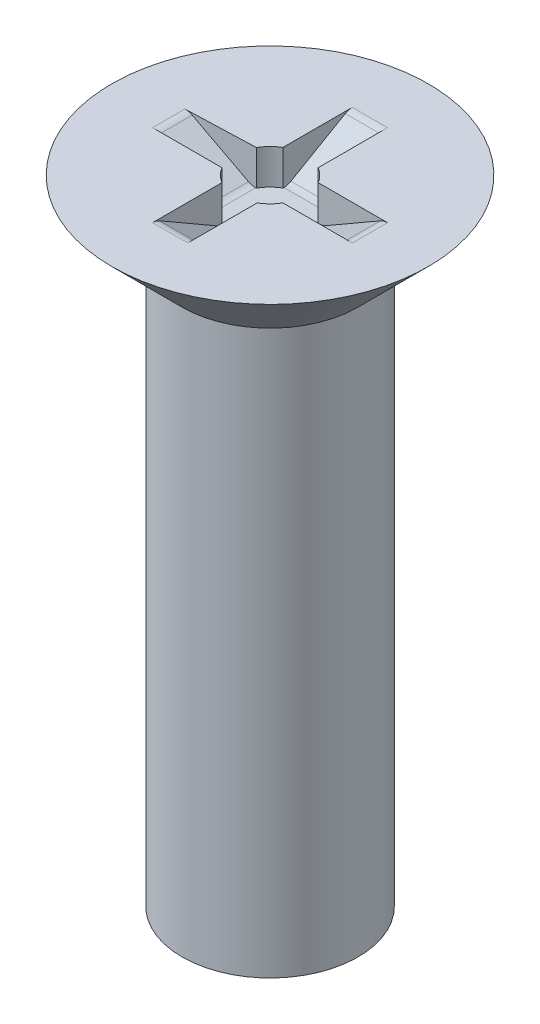
ISO-10303-21;
HEADER;
FILE_DESCRIPTION(('STEP AP214'),'2;1');
FILE_NAME('part.step','',(''),(''),'','','');
FILE_SCHEMA(('AUTOMOTIVE_DESIGN { 1 0 10303 214 1 1 1 1 }'));
ENDSEC;
DATA;
#1=APPLICATION_CONTEXT('core data for automotive mechanical design processes');
#2=APPLICATION_PROTOCOL_DEFINITION('international standard','automotive_design',2000,#1);
#3=PRODUCT_CONTEXT('',#1,'mechanical');
#4=PRODUCT('Part','Part','',(#3));
#5=PRODUCT_RELATED_PRODUCT_CATEGORY('part','',(#4));
#6=PRODUCT_DEFINITION_FORMATION('','',#4);
#7=PRODUCT_DEFINITION_CONTEXT('part definition',#1,'design');
#8=PRODUCT_DEFINITION('design','',#6,#7);
#9=PRODUCT_DEFINITION_SHAPE('','',#8);
#10=(LENGTH_UNIT() NAMED_UNIT(*) SI_UNIT(.MILLI.,.METRE.));
#11=(NAMED_UNIT(*) PLANE_ANGLE_UNIT() SI_UNIT($,.RADIAN.));
#12=(NAMED_UNIT(*) SI_UNIT($,.STERADIAN.) SOLID_ANGLE_UNIT());
#13=UNCERTAINTY_MEASURE_WITH_UNIT(LENGTH_MEASURE(1.E-05),#10,'distance_accuracy_value','');
#14=(GEOMETRIC_REPRESENTATION_CONTEXT(3) GLOBAL_UNCERTAINTY_ASSIGNED_CONTEXT((#13)) GLOBAL_UNIT_ASSIGNED_CONTEXT((#10,
#11,#12)) REPRESENTATION_CONTEXT('',''));
#15=CARTESIAN_POINT('',(0.,0.,0.));
#16=DIRECTION('',(0.,0.,1.));
#17=DIRECTION('',(1.,0.,0.));
#18=AXIS2_PLACEMENT_3D('',#15,#16,#17);
#19=CARTESIAN_POINT('',(0.,8.5,0.));
#20=DIRECTION('',(0.,1.,0.));
#21=DIRECTION('',(0.,0.,1.));
#22=AXIS2_PLACEMENT_3D('',#19,#20,#21);
#23=CYLINDRICAL_SURFACE('',#22,0.5);
#24=DIRECTION('',(0.,1.,0.));
#25=VECTOR('',#24,1.);
#26=CARTESIAN_POINT('',(-0.436712210598167,8.5,-0.243479865932406));
#27=LINE('',#26,#25);
#28=CARTESIAN_POINT('',(-0.436712210598167,8.5,-0.243479865932406));
#29=VERTEX_POINT('',#28);
#30=CARTESIAN_POINT('',(-0.436712210598167,9.,-0.243479865932406));
#31=VERTEX_POINT('',#30);
#32=EDGE_CURVE('E225',#29,#31,#27,.T.);
#33=ORIENTED_EDGE('',*,*,#32,.F.);
#34=CARTESIAN_POINT('',(0.,8.5,0.));
#35=DIRECTION('',(0.,1.,0.));
#36=DIRECTION('',(0.,0.,1.));
#37=AXIS2_PLACEMENT_3D('',#34,#35,#36);
#38=CIRCLE('',#37,0.5);
#39=CARTESIAN_POINT('',(-0.250000000000001,8.5,-0.433012701892218));
#40=VERTEX_POINT('',#39);
#41=EDGE_CURVE('E246',#40,#29,#38,.T.);
#42=ORIENTED_EDGE('',*,*,#41,.F.);
#43=DIRECTION('',(0.,1.,0.));
#44=VECTOR('',#43,1.);
#45=CARTESIAN_POINT('',(-0.250000000000001,8.5,-0.433012701892218));
#46=LINE('',#45,#44);
#47=CARTESIAN_POINT('',(-0.250000000000001,9.,-0.433012701892218));
#48=VERTEX_POINT('',#47);
#49=EDGE_CURVE('E384',#40,#48,#46,.T.);
#50=ORIENTED_EDGE('',*,*,#49,.T.);
#51=CARTESIAN_POINT('',(0.,9.,0.));
#52=DIRECTION('',(0.,1.,0.));
#53=DIRECTION('',(0.,0.,1.));
#54=AXIS2_PLACEMENT_3D('',#51,#52,#53);
#55=CIRCLE('',#54,0.5);
#56=EDGE_CURVE('E231',#48,#31,#55,.T.);
#57=ORIENTED_EDGE('',*,*,#56,.T.);
#58=EDGE_LOOP('',(#33,#42,#50,#57));
#59=FACE_BOUND('',#58,.T.);
#60=ADVANCED_FACE('F45',(#59),#23,.F.);
#61=DIRECTION('',(0.,1.,0.));
#62=VECTOR('',#61,1.);
#63=CARTESIAN_POINT('',(0.249999999999999,8.5,-0.43301270189222));
#64=LINE('',#63,#62);
#65=CARTESIAN_POINT('',(0.249999999999999,8.5,-0.43301270189222));
#66=VERTEX_POINT('',#65);
#67=CARTESIAN_POINT('',(0.249999999999999,9.,-0.43301270189222));
#68=VERTEX_POINT('',#67);
#69=EDGE_CURVE('E382',#66,#68,#64,.T.);
#70=ORIENTED_EDGE('',*,*,#69,.F.);
#71=CARTESIAN_POINT('',(0.433012701892219,8.5,-0.25));
#72=VERTEX_POINT('',#71);
#73=EDGE_CURVE('E252',#72,#66,#38,.T.);
#74=ORIENTED_EDGE('',*,*,#73,.F.);
#75=DIRECTION('',(0.,1.,0.));
#76=VECTOR('',#75,1.);
#77=CARTESIAN_POINT('',(0.433012701892219,8.5,-0.25));
#78=LINE('',#77,#76);
#79=CARTESIAN_POINT('',(0.433012701892219,9.,-0.25));
#80=VERTEX_POINT('',#79);
#81=EDGE_CURVE('E236',#72,#80,#78,.T.);
#82=ORIENTED_EDGE('',*,*,#81,.T.);
#83=EDGE_CURVE('E234',#80,#68,#55,.T.);
#84=ORIENTED_EDGE('',*,*,#83,.T.);
#85=EDGE_LOOP('',(#70,#74,#82,#84));
#86=FACE_BOUND('',#85,.T.);
#87=ADVANCED_FACE('F404',(#86),#23,.F.);
#88=CARTESIAN_POINT('',(-0.433012701892219,8.5,0.25));
#89=VERTEX_POINT('',#88);
#90=CARTESIAN_POINT('',(-0.249999999999995,8.5,0.433012701892222));
#91=VERTEX_POINT('',#90);
#92=EDGE_CURVE('E223',#89,#91,#38,.T.);
#93=ORIENTED_EDGE('',*,*,#92,.F.);
#94=DIRECTION('',(0.,1.,0.));
#95=VECTOR('',#94,1.);
#96=CARTESIAN_POINT('',(-0.433012701892219,8.5,0.25));
#97=LINE('',#96,#95);
#98=CARTESIAN_POINT('',(-0.433012701892219,9.,0.25));
#99=VERTEX_POINT('',#98);
#100=EDGE_CURVE('E206',#89,#99,#97,.T.);
#101=ORIENTED_EDGE('',*,*,#100,.T.);
#102=CARTESIAN_POINT('',(-0.249999999999995,9.,0.433012701892222));
#103=VERTEX_POINT('',#102);
#104=EDGE_CURVE('E221',#99,#103,#55,.T.);
#105=ORIENTED_EDGE('',*,*,#104,.T.);
#106=DIRECTION('',(0.,1.,0.));
#107=VECTOR('',#106,1.);
#108=CARTESIAN_POINT('',(-0.249999999999995,8.5,0.433012701892222));
#109=LINE('',#108,#107);
#110=EDGE_CURVE('E356',#91,#103,#109,.T.);
#111=ORIENTED_EDGE('',*,*,#110,.F.);
#112=EDGE_LOOP('',(#93,#101,#105,#111));
#113=FACE_BOUND('',#112,.T.);
#114=ADVANCED_FACE('F219',(#113),#23,.F.);
#115=CARTESIAN_POINT('',(0.,8.,0.));
#116=DIRECTION('',(0.,-1.,0.));
#117=DIRECTION('',(0.,0.,-1.));
#118=AXIS2_PLACEMENT_3D('',#115,#116,#117);
#119=CYLINDRICAL_SURFACE('',#118,1.25);
#120=CARTESIAN_POINT('',(0.,8.,0.));
#121=DIRECTION('',(0.,1.,0.));
#122=DIRECTION('',(0.,0.,1.));
#123=AXIS2_PLACEMENT_3D('',#120,#121,#122);
#124=CIRCLE('',#123,1.25);
#125=CARTESIAN_POINT('',(0.,8.,1.25));
#126=VERTEX_POINT('',#125);
#127=EDGE_CURVE('E265',#126,#126,#124,.T.);
#128=ORIENTED_EDGE('',*,*,#127,.F.);
#129=EDGE_LOOP('',(#128));
#130=FACE_BOUND('',#129,.T.);
#131=CARTESIAN_POINT('',(0.,0.,0.));
#132=DIRECTION('',(0.,1.,0.));
#133=DIRECTION('',(0.,0.,1.));
#134=AXIS2_PLACEMENT_3D('',#131,#132,#133);
#135=CIRCLE('',#134,1.25);
#136=CARTESIAN_POINT('',(0.,0.,1.25));
#137=VERTEX_POINT('',#136);
#138=EDGE_CURVE('E262',#137,#137,#135,.T.);
#139=ORIENTED_EDGE('',*,*,#138,.T.);
#140=EDGE_LOOP('',(#139));
#141=FACE_BOUND('',#140,.T.);
#142=ADVANCED_FACE('F438',(#130,#141),#119,.T.);
#143=CARTESIAN_POINT('',(0.,0.,0.));
#144=DIRECTION('',(0.,1.,0.));
#145=DIRECTION('',(0.,0.,1.));
#146=AXIS2_PLACEMENT_3D('',#143,#144,#145);
#147=PLANE('',#146);
#148=ORIENTED_EDGE('',*,*,#138,.F.);
#149=EDGE_LOOP('',(#148));
#150=FACE_BOUND('',#149,.T.);
#151=ADVANCED_FACE('F435',(#150),#147,.F.);
#152=CARTESIAN_POINT('',(0.,9.,0.));
#153=DIRECTION('',(0.,1.,0.));
#154=DIRECTION('',(0.,0.,1.));
#155=AXIS2_PLACEMENT_3D('',#152,#153,#154);
#156=PLANE('',#155);
#157=DIRECTION('',(-1.,0.,0.));
#158=VECTOR('',#157,1.);
#159=CARTESIAN_POINT('',(-0.249999999999985,9.,1.41961524227065));
#160=LINE('',#159,#158);
#161=CARTESIAN_POINT('',(0.250000000000015,9.,1.41961524227065));
#162=VERTEX_POINT('',#161);
#163=CARTESIAN_POINT('',(-0.249999999999985,9.,1.41961524227065));
#164=VERTEX_POINT('',#163);
#165=EDGE_CURVE('E287',#162,#164,#160,.T.);
#166=ORIENTED_EDGE('',*,*,#165,.T.);
#167=DIRECTION('',(0.,0.,-1.));
#168=VECTOR('',#167,1.);
#169=CARTESIAN_POINT('',(-0.249999999999986,9.,1.36602540378443));
#170=LINE('',#169,#168);
#171=EDGE_CURVE('E224',#164,#103,#170,.T.);
#172=ORIENTED_EDGE('',*,*,#171,.T.);
#173=ORIENTED_EDGE('',*,*,#104,.F.);
#174=DIRECTION('',(-1.,0.,0.));
#175=VECTOR('',#174,1.);
#176=CARTESIAN_POINT('',(-0.25,9.,0.25));
#177=LINE('',#176,#175);
#178=CARTESIAN_POINT('',(-1.41961524227065,9.,0.25));
#179=VERTEX_POINT('',#178);
#180=EDGE_CURVE('E202',#99,#179,#177,.T.);
#181=ORIENTED_EDGE('',*,*,#180,.T.);
#182=DIRECTION('',(0.,0.,-1.));
#183=VECTOR('',#182,1.);
#184=CARTESIAN_POINT('',(-1.41961524227065,9.,-0.211027534127505));
#185=LINE('',#184,#183);
#186=CARTESIAN_POINT('',(-1.41961524227065,9.,-0.209156135730628));
#187=VERTEX_POINT('',#186);
#188=EDGE_CURVE('E282',#179,#187,#185,.T.);
#189=ORIENTED_EDGE('',*,*,#188,.T.);
#190=DIRECTION('',(0.999390827019096,0.,-0.0348994967025045));
#191=VECTOR('',#190,1.);
#192=CARTESIAN_POINT('',(-0.00902405293553858,9.,-0.258415065500495));
#193=LINE('',#192,#191);
#194=EDGE_CURVE('E277',#187,#31,#193,.T.);
#195=ORIENTED_EDGE('',*,*,#194,.T.);
#196=ORIENTED_EDGE('',*,*,#56,.F.);
#197=DIRECTION('',(0.,0.,-1.));
#198=VECTOR('',#197,1.);
#199=CARTESIAN_POINT('',(-0.250000000000001,9.,-0.249999999999999));
#200=LINE('',#199,#198);
#201=CARTESIAN_POINT('',(-0.250000000000005,9.,-1.41961524227065));
#202=VERTEX_POINT('',#201);
#203=EDGE_CURVE('E351',#48,#202,#200,.T.);
#204=ORIENTED_EDGE('',*,*,#203,.T.);
#205=DIRECTION('',(1.,0.,0.));
#206=VECTOR('',#205,1.);
#207=CARTESIAN_POINT('',(0.249999999999995,9.,-1.41961524227065));
#208=LINE('',#207,#206);
#209=CARTESIAN_POINT('',(0.249999999999995,9.,-1.41961524227065));
#210=VERTEX_POINT('',#209);
#211=EDGE_CURVE('E269',#202,#210,#208,.T.);
#212=ORIENTED_EDGE('',*,*,#211,.T.);
#213=DIRECTION('',(0.,0.,1.));
#214=VECTOR('',#213,1.);
#215=CARTESIAN_POINT('',(0.249999999999995,9.,-1.36602540378443));
#216=LINE('',#215,#214);
#217=EDGE_CURVE('E340',#210,#68,#216,.T.);
#218=ORIENTED_EDGE('',*,*,#217,.T.);
#219=ORIENTED_EDGE('',*,*,#83,.F.);
#220=DIRECTION('',(1.,0.,0.));
#221=VECTOR('',#220,1.);
#222=CARTESIAN_POINT('',(0.25,9.,-0.25));
#223=LINE('',#222,#221);
#224=CARTESIAN_POINT('',(1.41961524227065,9.,-0.25));
#225=VERTEX_POINT('',#224);
#226=EDGE_CURVE('E387',#80,#225,#223,.T.);
#227=ORIENTED_EDGE('',*,*,#226,.T.);
#228=DIRECTION('',(0.,0.,1.));
#229=VECTOR('',#228,1.);
#230=CARTESIAN_POINT('',(1.41961524227065,9.,0.25));
#231=LINE('',#230,#229);
#232=CARTESIAN_POINT('',(1.41961524227065,9.,0.25));
#233=VERTEX_POINT('',#232);
#234=EDGE_CURVE('E284',#225,#233,#231,.T.);
#235=ORIENTED_EDGE('',*,*,#234,.T.);
#236=DIRECTION('',(-1.,0.,0.));
#237=VECTOR('',#236,1.);
#238=CARTESIAN_POINT('',(1.36602540378443,9.,0.25));
#239=LINE('',#238,#237);
#240=CARTESIAN_POINT('',(0.433012701892219,9.,0.25));
#241=VERTEX_POINT('',#240);
#242=EDGE_CURVE('E386',#233,#241,#239,.T.);
#243=ORIENTED_EDGE('',*,*,#242,.T.);
#244=CARTESIAN_POINT('',(0.250000000000004,9.,0.433012701892217));
#245=VERTEX_POINT('',#244);
#246=EDGE_CURVE('E232',#245,#241,#55,.T.);
#247=ORIENTED_EDGE('',*,*,#246,.F.);
#248=DIRECTION('',(0.,0.,1.));
#249=VECTOR('',#248,1.);
#250=CARTESIAN_POINT('',(0.250000000000003,9.,0.249999999999997));
#251=LINE('',#250,#249);
#252=EDGE_CURVE('E363',#245,#162,#251,.T.);
#253=ORIENTED_EDGE('',*,*,#252,.T.);
#254=EDGE_LOOP('',(#166,#172,#173,#181,#189,#195,#196,#204,#212,#218,#219,#227,#235,#243,#247,#253));
#255=FACE_BOUND('',#254,.T.);
#256=CARTESIAN_POINT('',(0.,9.,0.));
#257=DIRECTION('',(0.,1.,0.));
#258=DIRECTION('',(0.,0.,1.));
#259=AXIS2_PLACEMENT_3D('',#256,#257,#258);
#260=CIRCLE('',#259,2.25);
#261=CARTESIAN_POINT('',(0.,9.,2.25));
#262=VERTEX_POINT('',#261);
#263=EDGE_CURVE('E258',#262,#262,#260,.T.);
#264=ORIENTED_EDGE('',*,*,#263,.T.);
#265=EDGE_LOOP('',(#264));
#266=FACE_BOUND('',#265,.T.);
#267=ADVANCED_FACE('F229',(#255,#266),#156,.T.);
#268=CARTESIAN_POINT('',(0.,9.,0.));
#269=DIRECTION('',(0.,1.,0.));
#270=DIRECTION('',(0.,0.,1.));
#271=AXIS2_PLACEMENT_3D('',#268,#269,#270);
#272=CONICAL_SURFACE('',#271,2.25,0.78539816339745);
#273=ORIENTED_EDGE('',*,*,#127,.T.);
#274=EDGE_LOOP('',(#273));
#275=FACE_BOUND('',#274,.T.);
#276=ORIENTED_EDGE('',*,*,#263,.F.);
#277=EDGE_LOOP('',(#276));
#278=FACE_BOUND('',#277,.T.);
#279=ADVANCED_FACE('F424',(#275,#278),#272,.T.);
#280=CARTESIAN_POINT('',(0.250000000000005,8.5,0.433012701892217));
#281=VERTEX_POINT('',#280);
#282=CARTESIAN_POINT('',(0.433012701892219,8.5,0.25));
#283=VERTEX_POINT('',#282);
#284=EDGE_CURVE('E240',#281,#283,#38,.T.);
#285=ORIENTED_EDGE('',*,*,#284,.F.);
#286=DIRECTION('',(0.,1.,0.));
#287=VECTOR('',#286,1.);
#288=CARTESIAN_POINT('',(0.250000000000005,8.5,0.433012701892217));
#289=LINE('',#288,#287);
#290=EDGE_CURVE('E379',#281,#245,#289,.T.);
#291=ORIENTED_EDGE('',*,*,#290,.T.);
#292=ORIENTED_EDGE('',*,*,#246,.T.);
#293=DIRECTION('',(0.,1.,0.));
#294=VECTOR('',#293,1.);
#295=CARTESIAN_POINT('',(0.433012701892219,8.5,0.25));
#296=LINE('',#295,#294);
#297=EDGE_CURVE('E395',#283,#241,#296,.T.);
#298=ORIENTED_EDGE('',*,*,#297,.F.);
#299=EDGE_LOOP('',(#285,#291,#292,#298));
#300=FACE_BOUND('',#299,.T.);
#301=ADVANCED_FACE('F416',(#300),#23,.F.);
#302=CARTESIAN_POINT('',(0.,8.5,0.));
#303=DIRECTION('',(0.,1.,0.));
#304=DIRECTION('',(0.,0.,1.));
#305=AXIS2_PLACEMENT_3D('',#302,#303,#304);
#306=PLANE('',#305);
#307=DIRECTION('',(-1.,0.,0.));
#308=VECTOR('',#307,1.);
#309=CARTESIAN_POINT('',(0.5,8.5,0.25));
#310=LINE('',#309,#308);
#311=CARTESIAN_POINT('',(0.446410161513777,8.5,0.25));
#312=VERTEX_POINT('',#311);
#313=EDGE_CURVE('E390',#312,#283,#310,.T.);
#314=ORIENTED_EDGE('',*,*,#313,.F.);
#315=DIRECTION('',(0.,0.,1.));
#316=VECTOR('',#315,1.);
#317=CARTESIAN_POINT('',(0.446410161513777,8.5,0.));
#318=LINE('',#317,#316);
#319=CARTESIAN_POINT('',(0.446410161513777,8.5,-0.25));
#320=VERTEX_POINT('',#319);
#321=EDGE_CURVE('E302',#312,#320,#318,.F.);
#322=ORIENTED_EDGE('',*,*,#321,.T.);
#323=DIRECTION('',(-1.,0.,0.));
#324=VECTOR('',#323,1.);
#325=CARTESIAN_POINT('',(0.5,8.5,-0.25));
#326=LINE('',#325,#324);
#327=EDGE_CURVE('E393',#320,#72,#326,.T.);
#328=ORIENTED_EDGE('',*,*,#327,.T.);
#329=ORIENTED_EDGE('',*,*,#73,.T.);
#330=DIRECTION('',(0.,0.,1.));
#331=VECTOR('',#330,1.);
#332=CARTESIAN_POINT('',(0.249999999999998,8.5,-0.500000000000001));
#333=LINE('',#332,#331);
#334=CARTESIAN_POINT('',(0.249999999999998,8.5,-0.446410161513778));
#335=VERTEX_POINT('',#334);
#336=EDGE_CURVE('E345',#335,#66,#333,.T.);
#337=ORIENTED_EDGE('',*,*,#336,.F.);
#338=DIRECTION('',(1.,0.,0.));
#339=VECTOR('',#338,1.);
#340=CARTESIAN_POINT('',(0.,8.5,-0.446410161513777));
#341=LINE('',#340,#339);
#342=CARTESIAN_POINT('',(-0.250000000000002,8.5,-0.446410161513776));
#343=VERTEX_POINT('',#342);
#344=EDGE_CURVE('E298',#335,#343,#341,.F.);
#345=ORIENTED_EDGE('',*,*,#344,.T.);
#346=DIRECTION('',(0.,0.,1.));
#347=VECTOR('',#346,1.);
#348=CARTESIAN_POINT('',(-0.250000000000002,8.5,-0.499999999999999));
#349=LINE('',#348,#347);
#350=EDGE_CURVE('E354',#343,#40,#349,.T.);
#351=ORIENTED_EDGE('',*,*,#350,.T.);
#352=ORIENTED_EDGE('',*,*,#41,.T.);
#353=DIRECTION('',(0.999390827019096,0.,-0.0348994967025045));
#354=VECTOR('',#353,1.);
#355=CARTESIAN_POINT('',(-0.00902405293553858,8.5,-0.258415065500495));
#356=LINE('',#355,#354);
#357=CARTESIAN_POINT('',(-0.446410161513777,8.5,-0.24314120602394));
#358=VERTEX_POINT('',#357);
#359=EDGE_CURVE('E216',#358,#29,#356,.T.);
#360=ORIENTED_EDGE('',*,*,#359,.F.);
#361=DIRECTION('',(0.,0.,-1.));
#362=VECTOR('',#361,1.);
#363=CARTESIAN_POINT('',(-0.446410161513777,8.5,0.));
#364=LINE('',#363,#362);
#365=CARTESIAN_POINT('',(-0.446410161513777,8.5,0.25));
#366=VERTEX_POINT('',#365);
#367=EDGE_CURVE('E300',#358,#366,#364,.F.);
#368=ORIENTED_EDGE('',*,*,#367,.T.);
#369=DIRECTION('',(1.,0.,0.));
#370=VECTOR('',#369,1.);
#371=CARTESIAN_POINT('',(-0.5,8.5,0.25));
#372=LINE('',#371,#370);
#373=EDGE_CURVE('E272',#366,#89,#372,.T.);
#374=ORIENTED_EDGE('',*,*,#373,.T.);
#375=ORIENTED_EDGE('',*,*,#92,.T.);
#376=DIRECTION('',(0.,0.,-1.));
#377=VECTOR('',#376,1.);
#378=CARTESIAN_POINT('',(-0.249999999999995,8.5,0.500000000000003));
#379=LINE('',#378,#377);
#380=CARTESIAN_POINT('',(-0.249999999999995,8.5,0.500000000000003));
#381=VERTEX_POINT('',#380);
#382=EDGE_CURVE('E366',#381,#91,#379,.T.);
#383=ORIENTED_EDGE('',*,*,#382,.F.);
#384=DIRECTION('',(-1.,0.,0.));
#385=VECTOR('',#384,1.);
#386=CARTESIAN_POINT('',(0.250000000000005,8.5,0.499999999999997));
#387=LINE('',#386,#385);
#388=CARTESIAN_POINT('',(0.250000000000005,8.5,0.499999999999997));
#389=VERTEX_POINT('',#388);
#390=EDGE_CURVE('E360',#389,#381,#387,.T.);
#391=ORIENTED_EDGE('',*,*,#390,.F.);
#392=DIRECTION('',(0.,0.,-1.));
#393=VECTOR('',#392,1.);
#394=CARTESIAN_POINT('',(0.250000000000005,8.5,0.499999999999997));
#395=LINE('',#394,#393);
#396=EDGE_CURVE('E369',#389,#281,#395,.T.);
#397=ORIENTED_EDGE('',*,*,#396,.T.);
#398=ORIENTED_EDGE('',*,*,#284,.T.);
#399=EDGE_LOOP('',(#314,#322,#328,#329,#337,#345,#351,#352,#360,#368,#374,#375,#383,#391,#397,#398));
#400=FACE_BOUND('',#399,.T.);
#401=ADVANCED_FACE('F412',(#400),#306,.T.);
#402=CARTESIAN_POINT('',(0.,0.,-0.25));
#403=DIRECTION('',(0.,0.,-1.));
#404=DIRECTION('',(-1.,0.,0.));
#405=AXIS2_PLACEMENT_3D('',#402,#403,#404);
#406=PLANE('',#405);
#407=ORIENTED_EDGE('',*,*,#327,.F.);
#408=CARTESIAN_POINT('',(0.446410161513777,8.7,-0.25));
#409=DIRECTION('',(0.,0.,-1.));
#410=DIRECTION('',(-1.,0.,0.));
#411=AXIS2_PLACEMENT_3D('',#408,#409,#410);
#412=CIRCLE('',#411,0.2);
#413=CARTESIAN_POINT('',(0.546410161513778,8.52679491924311,-0.25));
#414=VERTEX_POINT('',#413);
#415=EDGE_CURVE('E304',#320,#414,#412,.F.);
#416=ORIENTED_EDGE('',*,*,#415,.T.);
#417=DIRECTION('',(0.866025403784436,0.500000000000004,0.));
#418=VECTOR('',#417,1.);
#419=CARTESIAN_POINT('',(0.5,8.5,-0.25));
#420=LINE('',#419,#418);
#421=CARTESIAN_POINT('',(1.31961524227065,8.97320508075689,-0.25));
#422=VERTEX_POINT('',#421);
#423=EDGE_CURVE('E389',#414,#422,#420,.T.);
#424=ORIENTED_EDGE('',*,*,#423,.T.);
#425=CARTESIAN_POINT('',(1.41961524227065,8.8,-0.25));
#426=DIRECTION('',(0.,0.,-1.));
#427=DIRECTION('',(-1.,0.,0.));
#428=AXIS2_PLACEMENT_3D('',#425,#426,#427);
#429=CIRCLE('',#428,0.2);
#430=EDGE_CURVE('E329',#422,#225,#429,.T.);
#431=ORIENTED_EDGE('',*,*,#430,.T.);
#432=ORIENTED_EDGE('',*,*,#226,.F.);
#433=ORIENTED_EDGE('',*,*,#81,.F.);
#434=EDGE_LOOP('',(#407,#416,#424,#431,#432,#433));
#435=FACE_BOUND('',#434,.T.);
#436=ADVANCED_FACE('F415',(#435),#406,.F.);
#437=CARTESIAN_POINT('',(0.,0.,0.25));
#438=DIRECTION('',(0.,0.,-1.));
#439=DIRECTION('',(-1.,0.,0.));
#440=AXIS2_PLACEMENT_3D('',#437,#438,#439);
#441=PLANE('',#440);
#442=DIRECTION('',(0.866025403784436,0.500000000000004,0.));
#443=VECTOR('',#442,1.);
#444=CARTESIAN_POINT('',(0.5,8.5,0.25));
#445=LINE('',#444,#443);
#446=CARTESIAN_POINT('',(0.546410161513778,8.52679491924311,0.25));
#447=VERTEX_POINT('',#446);
#448=CARTESIAN_POINT('',(1.31961524227065,8.97320508075689,0.25));
#449=VERTEX_POINT('',#448);
#450=EDGE_CURVE('E398',#447,#449,#445,.T.);
#451=ORIENTED_EDGE('',*,*,#450,.F.);
#452=CARTESIAN_POINT('',(0.446410161513777,8.7,0.25));
#453=DIRECTION('',(0.,0.,-1.));
#454=DIRECTION('',(-1.,0.,0.));
#455=AXIS2_PLACEMENT_3D('',#452,#453,#454);
#456=CIRCLE('',#455,0.2);
#457=EDGE_CURVE('E296',#447,#312,#456,.T.);
#458=ORIENTED_EDGE('',*,*,#457,.T.);
#459=ORIENTED_EDGE('',*,*,#313,.T.);
#460=ORIENTED_EDGE('',*,*,#297,.T.);
#461=ORIENTED_EDGE('',*,*,#242,.F.);
#462=CARTESIAN_POINT('',(1.41961524227065,8.8,0.25));
#463=DIRECTION('',(0.,0.,-1.));
#464=DIRECTION('',(-1.,0.,0.));
#465=AXIS2_PLACEMENT_3D('',#462,#463,#464);
#466=CIRCLE('',#465,0.2);
#467=EDGE_CURVE('E327',#233,#449,#466,.F.);
#468=ORIENTED_EDGE('',*,*,#467,.T.);
#469=EDGE_LOOP('',(#451,#458,#459,#460,#461,#468));
#470=FACE_BOUND('',#469,.T.);
#471=ADVANCED_FACE('F422',(#470),#441,.T.);
#472=CARTESIAN_POINT('',(0.5,8.5,-0.25));
#473=DIRECTION('',(0.500000000000004,-0.866025403784436,0.));
#474=DIRECTION('',(0.866025403784436,0.500000000000004,0.));
#475=AXIS2_PLACEMENT_3D('',#472,#473,#474);
#476=PLANE('',#475);
#477=ORIENTED_EDGE('',*,*,#450,.T.);
#478=DIRECTION('',(0.,0.,1.));
#479=VECTOR('',#478,1.);
#480=CARTESIAN_POINT('',(1.31961524227065,8.97320508075689,-0.25));
#481=LINE('',#480,#479);
#482=EDGE_CURVE('E294',#449,#422,#481,.F.);
#483=ORIENTED_EDGE('',*,*,#482,.T.);
#484=ORIENTED_EDGE('',*,*,#423,.F.);
#485=DIRECTION('',(0.,0.,1.));
#486=VECTOR('',#485,1.);
#487=CARTESIAN_POINT('',(0.546410161513778,8.52679491924311,-0.25));
#488=LINE('',#487,#486);
#489=EDGE_CURVE('E291',#414,#447,#488,.T.);
#490=ORIENTED_EDGE('',*,*,#489,.T.);
#491=EDGE_LOOP('',(#477,#483,#484,#490));
#492=FACE_BOUND('',#491,.T.);
#493=ADVANCED_FACE('F605',(#492),#476,.F.);
#494=CARTESIAN_POINT('',(0.25,0.,0.));
#495=DIRECTION('',(1.,0.,0.));
#496=DIRECTION('',(0.,0.,-1.));
#497=AXIS2_PLACEMENT_3D('',#494,#495,#496);
#498=PLANE('',#497);
#499=ORIENTED_EDGE('',*,*,#396,.F.);
#500=DIRECTION('',(0.,0.500000000000004,0.866025403784436));
#501=VECTOR('',#500,1.);
#502=CARTESIAN_POINT('',(0.250000000000005,8.5,0.499999999999997));
#503=LINE('',#502,#501);
#504=CARTESIAN_POINT('',(0.250000000000014,8.97320508075689,1.31961524227065));
#505=VERTEX_POINT('',#504);
#506=EDGE_CURVE('E365',#389,#505,#503,.T.);
#507=ORIENTED_EDGE('',*,*,#506,.T.);
#508=CARTESIAN_POINT('',(0.250000000000015,8.8,1.41961524227065));
#509=DIRECTION('',(1.,0.,0.));
#510=DIRECTION('',(0.,0.,-1.));
#511=AXIS2_PLACEMENT_3D('',#508,#509,#510);
#512=CIRCLE('',#511,0.2);
#513=EDGE_CURVE('E324',#505,#162,#512,.T.);
#514=ORIENTED_EDGE('',*,*,#513,.T.);
#515=ORIENTED_EDGE('',*,*,#252,.F.);
#516=ORIENTED_EDGE('',*,*,#290,.F.);
#517=EDGE_LOOP('',(#499,#507,#514,#515,#516));
#518=FACE_BOUND('',#517,.T.);
#519=ADVANCED_FACE('F594',(#518),#498,.F.);
#520=CARTESIAN_POINT('',(-0.25,0.,0.));
#521=DIRECTION('',(1.,0.,0.));
#522=DIRECTION('',(0.,0.,-1.));
#523=AXIS2_PLACEMENT_3D('',#520,#521,#522);
#524=PLANE('',#523);
#525=ORIENTED_EDGE('',*,*,#110,.T.);
#526=ORIENTED_EDGE('',*,*,#171,.F.);
#527=CARTESIAN_POINT('',(-0.249999999999985,8.8,1.41961524227065));
#528=DIRECTION('',(1.,0.,0.));
#529=DIRECTION('',(0.,0.,-1.));
#530=AXIS2_PLACEMENT_3D('',#527,#528,#529);
#531=CIRCLE('',#530,0.2);
#532=CARTESIAN_POINT('',(-0.249999999999986,8.97320508075689,1.31961524227065));
#533=VERTEX_POINT('',#532);
#534=EDGE_CURVE('E322',#164,#533,#531,.F.);
#535=ORIENTED_EDGE('',*,*,#534,.T.);
#536=DIRECTION('',(0.,0.500000000000004,0.866025403784436));
#537=VECTOR('',#536,1.);
#538=CARTESIAN_POINT('',(-0.249999999999995,8.5,0.500000000000003));
#539=LINE('',#538,#537);
#540=EDGE_CURVE('E372',#381,#533,#539,.T.);
#541=ORIENTED_EDGE('',*,*,#540,.F.);
#542=ORIENTED_EDGE('',*,*,#382,.T.);
#543=EDGE_LOOP('',(#525,#526,#535,#541,#542));
#544=FACE_BOUND('',#543,.T.);
#545=ADVANCED_FACE('F583',(#544),#524,.T.);
#546=CARTESIAN_POINT('',(0.250000000000005,8.5,0.499999999999997));
#547=DIRECTION('',(0.,-0.866025403784436,0.500000000000004));
#548=DIRECTION('',(0.,-0.500000000000004,-0.866025403784436));
#549=AXIS2_PLACEMENT_3D('',#546,#547,#548);
#550=PLANE('',#549);
#551=ORIENTED_EDGE('',*,*,#540,.T.);
#552=DIRECTION('',(-1.,0.,0.));
#553=VECTOR('',#552,1.);
#554=CARTESIAN_POINT('',(0.250000000000014,8.97320508075689,1.31961524227065));
#555=LINE('',#554,#553);
#556=EDGE_CURVE('E289',#533,#505,#555,.F.);
#557=ORIENTED_EDGE('',*,*,#556,.T.);
#558=ORIENTED_EDGE('',*,*,#506,.F.);
#559=ORIENTED_EDGE('',*,*,#390,.T.);
#560=EDGE_LOOP('',(#551,#557,#558,#559));
#561=FACE_BOUND('',#560,.T.);
#562=ADVANCED_FACE('F573',(#561),#550,.F.);
#563=CARTESIAN_POINT('',(-0.25,0.,0.));
#564=DIRECTION('',(-1.,0.,0.));
#565=DIRECTION('',(0.,0.,1.));
#566=AXIS2_PLACEMENT_3D('',#563,#564,#565);
#567=PLANE('',#566);
#568=ORIENTED_EDGE('',*,*,#350,.F.);
#569=CARTESIAN_POINT('',(-0.250000000000002,8.7,-0.446410161513776));
#570=DIRECTION('',(-1.,0.,0.));
#571=DIRECTION('',(0.,0.,1.));
#572=AXIS2_PLACEMENT_3D('',#569,#570,#571);
#573=CIRCLE('',#572,0.2);
#574=CARTESIAN_POINT('',(-0.250000000000002,8.52679491924311,-0.546410161513777));
#575=VERTEX_POINT('',#574);
#576=EDGE_CURVE('E67',#343,#575,#573,.F.);
#577=ORIENTED_EDGE('',*,*,#576,.T.);
#578=DIRECTION('',(0.,0.500000000000004,-0.866025403784436));
#579=VECTOR('',#578,1.);
#580=CARTESIAN_POINT('',(-0.250000000000002,8.5,-0.499999999999999));
#581=LINE('',#580,#579);
#582=CARTESIAN_POINT('',(-0.250000000000005,8.97320508075689,-1.31961524227065));
#583=VERTEX_POINT('',#582);
#584=EDGE_CURVE('E353',#575,#583,#581,.T.);
#585=ORIENTED_EDGE('',*,*,#584,.T.);
#586=CARTESIAN_POINT('',(-0.250000000000005,8.8,-1.41961524227065));
#587=DIRECTION('',(-1.,0.,0.));
#588=DIRECTION('',(0.,0.,1.));
#589=AXIS2_PLACEMENT_3D('',#586,#587,#588);
#590=CIRCLE('',#589,0.2);
#591=EDGE_CURVE('E11',#583,#202,#590,.T.);
#592=ORIENTED_EDGE('',*,*,#591,.T.);
#593=ORIENTED_EDGE('',*,*,#203,.F.);
#594=ORIENTED_EDGE('',*,*,#49,.F.);
#595=EDGE_LOOP('',(#568,#577,#585,#592,#593,#594));
#596=FACE_BOUND('',#595,.T.);
#597=ADVANCED_FACE('F349',(#596),#567,.F.);
#598=CARTESIAN_POINT('',(0.25,0.,0.));
#599=DIRECTION('',(-1.,0.,0.));
#600=DIRECTION('',(0.,0.,1.));
#601=AXIS2_PLACEMENT_3D('',#598,#599,#600);
#602=PLANE('',#601);
#603=DIRECTION('',(0.,0.500000000000004,-0.866025403784436));
#604=VECTOR('',#603,1.);
#605=CARTESIAN_POINT('',(0.249999999999998,8.5,-0.500000000000001));
#606=LINE('',#605,#604);
#607=CARTESIAN_POINT('',(0.249999999999998,8.52679491924311,-0.546410161513779));
#608=VERTEX_POINT('',#607);
#609=CARTESIAN_POINT('',(0.249999999999995,8.97320508075689,-1.31961524227065));
#610=VERTEX_POINT('',#609);
#611=EDGE_CURVE('E338',#608,#610,#606,.T.);
#612=ORIENTED_EDGE('',*,*,#611,.F.);
#613=CARTESIAN_POINT('',(0.249999999999998,8.7,-0.446410161513778));
#614=DIRECTION('',(-1.,0.,0.));
#615=DIRECTION('',(0.,0.,1.));
#616=AXIS2_PLACEMENT_3D('',#613,#614,#615);
#617=CIRCLE('',#616,0.2);
#618=EDGE_CURVE('E319',#608,#335,#617,.T.);
#619=ORIENTED_EDGE('',*,*,#618,.T.);
#620=ORIENTED_EDGE('',*,*,#336,.T.);
#621=ORIENTED_EDGE('',*,*,#69,.T.);
#622=ORIENTED_EDGE('',*,*,#217,.F.);
#623=CARTESIAN_POINT('',(0.249999999999995,8.8,-1.41961524227065));
#624=DIRECTION('',(-1.,0.,0.));
#625=DIRECTION('',(0.,0.,1.));
#626=AXIS2_PLACEMENT_3D('',#623,#624,#625);
#627=CIRCLE('',#626,0.2);
#628=EDGE_CURVE('E53',#210,#610,#627,.F.);
#629=ORIENTED_EDGE('',*,*,#628,.T.);
#630=EDGE_LOOP('',(#612,#619,#620,#621,#622,#629));
#631=FACE_BOUND('',#630,.T.);
#632=ADVANCED_FACE('F337',(#631),#602,.T.);
#633=CARTESIAN_POINT('',(-0.250000000000002,8.5,-0.499999999999999));
#634=DIRECTION('',(0.,-0.866025403784436,-0.500000000000004));
#635=DIRECTION('',(0.,0.500000000000004,-0.866025403784436));
#636=AXIS2_PLACEMENT_3D('',#633,#634,#635);
#637=PLANE('',#636);
#638=ORIENTED_EDGE('',*,*,#611,.T.);
#639=DIRECTION('',(1.,0.,0.));
#640=VECTOR('',#639,1.);
#641=CARTESIAN_POINT('',(-0.250000000000005,8.97320508075689,-1.31961524227065));
#642=LINE('',#641,#640);
#643=EDGE_CURVE('E60',#610,#583,#642,.F.);
#644=ORIENTED_EDGE('',*,*,#643,.T.);
#645=ORIENTED_EDGE('',*,*,#584,.F.);
#646=DIRECTION('',(1.,0.,0.));
#647=VECTOR('',#646,1.);
#648=CARTESIAN_POINT('',(-0.250000000000002,8.52679491924311,-0.546410161513777));
#649=LINE('',#648,#647);
#650=EDGE_CURVE('E315',#575,#608,#649,.T.);
#651=ORIENTED_EDGE('',*,*,#650,.T.);
#652=EDGE_LOOP('',(#638,#644,#645,#651));
#653=FACE_BOUND('',#652,.T.);
#654=ADVANCED_FACE('F343',(#653),#637,.F.);
#655=CARTESIAN_POINT('',(0.,0.,0.25));
#656=DIRECTION('',(0.,0.,1.));
#657=DIRECTION('',(1.,0.,0.));
#658=AXIS2_PLACEMENT_3D('',#655,#656,#657);
#659=PLANE('',#658);
#660=ORIENTED_EDGE('',*,*,#373,.F.);
#661=CARTESIAN_POINT('',(-0.446410161513777,8.7,0.25));
#662=DIRECTION('',(0.,0.,1.));
#663=DIRECTION('',(1.,0.,0.));
#664=AXIS2_PLACEMENT_3D('',#661,#662,#663);
#665=CIRCLE('',#664,0.2);
#666=CARTESIAN_POINT('',(-0.546410161513778,8.52679491924311,0.25));
#667=VERTEX_POINT('',#666);
#668=EDGE_CURVE('E313',#366,#667,#665,.F.);
#669=ORIENTED_EDGE('',*,*,#668,.T.);
#670=DIRECTION('',(-0.866025403784436,0.500000000000004,0.));
#671=VECTOR('',#670,1.);
#672=CARTESIAN_POINT('',(-0.5,8.5,0.25));
#673=LINE('',#672,#671);
#674=CARTESIAN_POINT('',(-1.31961524227065,8.97320508075689,0.25));
#675=VERTEX_POINT('',#674);
#676=EDGE_CURVE('E215',#667,#675,#673,.T.);
#677=ORIENTED_EDGE('',*,*,#676,.T.);
#678=CARTESIAN_POINT('',(-1.41961524227065,8.8,0.25));
#679=DIRECTION('',(0.,0.,1.));
#680=DIRECTION('',(1.,0.,0.));
#681=AXIS2_PLACEMENT_3D('',#678,#679,#680);
#682=CIRCLE('',#681,0.2);
#683=EDGE_CURVE('E210',#675,#179,#682,.T.);
#684=ORIENTED_EDGE('',*,*,#683,.T.);
#685=ORIENTED_EDGE('',*,*,#180,.F.);
#686=ORIENTED_EDGE('',*,*,#100,.F.);
#687=EDGE_LOOP('',(#660,#669,#677,#684,#685,#686));
#688=FACE_BOUND('',#687,.T.);
#689=ADVANCED_FACE('F205',(#688),#659,.F.);
#690=CARTESIAN_POINT('',(-0.250000000000001,0.,-0.25));
#691=DIRECTION('',(0.0348994967025045,0.,0.999390827019096));
#692=DIRECTION('',(0.999390827019096,0.,-0.0348994967025045));
#693=AXIS2_PLACEMENT_3D('',#690,#691,#692);
#694=PLANE('',#693);
#695=DIRECTION('',(-0.865629643935602,0.499771507944745,0.0302284532611019));
#696=VECTOR('',#695,1.);
#697=CARTESIAN_POINT('',(-0.512854882769926,8.50742177002762,-0.24082090522901));
#698=LINE('',#697,#696);
#699=CARTESIAN_POINT('',(-0.546410161513778,8.52679491924311,-0.239649129074765));
#700=VERTEX_POINT('',#699);
#701=CARTESIAN_POINT('',(-1.31961524227065,8.97320508075689,-0.212648212679803));
#702=VERTEX_POINT('',#701);
#703=EDGE_CURVE('E274',#700,#702,#698,.T.);
#704=ORIENTED_EDGE('',*,*,#703,.F.);
#705=CARTESIAN_POINT('',(-0.446410161513777,8.7,-0.24314120602394));
#706=DIRECTION('',(0.0348994967025045,0.,0.999390827019096));
#707=DIRECTION('',(0.999390827019096,0.,-0.0348994967025045));
#708=AXIS2_PLACEMENT_3D('',#705,#706,#707);
#709=ELLIPSE('',#708,0.200121908859764,0.2);
#710=EDGE_CURVE('E311',#700,#358,#709,.T.);
#711=ORIENTED_EDGE('',*,*,#710,.T.);
#712=ORIENTED_EDGE('',*,*,#359,.T.);
#713=ORIENTED_EDGE('',*,*,#32,.T.);
#714=ORIENTED_EDGE('',*,*,#194,.F.);
#715=CARTESIAN_POINT('',(-1.41961524227065,8.8,-0.209156135730628));
#716=DIRECTION('',(0.0348994967025045,0.,0.999390827019096));
#717=DIRECTION('',(-0.999390827019096,0.,0.0348994967025045));
#718=AXIS2_PLACEMENT_3D('',#715,#716,#717);
#719=ELLIPSE('',#718,0.200121908859764,0.2);
#720=EDGE_CURVE('E332',#187,#702,#719,.F.);
#721=ORIENTED_EDGE('',*,*,#720,.T.);
#722=EDGE_LOOP('',(#704,#711,#712,#713,#714,#721));
#723=FACE_BOUND('',#722,.T.);
#724=ADVANCED_FACE('F449',(#723),#694,.T.);
#725=CARTESIAN_POINT('',(-0.5,8.5,0.25));
#726=DIRECTION('',(-0.500000000000004,-0.866025403784436,0.));
#727=DIRECTION('',(0.866025403784436,-0.500000000000004,0.));
#728=AXIS2_PLACEMENT_3D('',#725,#726,#727);
#729=PLANE('',#728);
#730=ORIENTED_EDGE('',*,*,#703,.T.);
#731=DIRECTION('',(0.,0.,-1.));
#732=VECTOR('',#731,1.);
#733=CARTESIAN_POINT('',(-1.31961524227065,8.97320508075689,0.25));
#734=LINE('',#733,#732);
#735=EDGE_CURVE('E309',#702,#675,#734,.F.);
#736=ORIENTED_EDGE('',*,*,#735,.T.);
#737=ORIENTED_EDGE('',*,*,#676,.F.);
#738=DIRECTION('',(0.,0.,-1.));
#739=VECTOR('',#738,1.);
#740=CARTESIAN_POINT('',(-0.546410161513778,8.52679491924311,0.25));
#741=LINE('',#740,#739);
#742=EDGE_CURVE('E306',#667,#700,#741,.T.);
#743=ORIENTED_EDGE('',*,*,#742,.T.);
#744=EDGE_LOOP('',(#730,#736,#737,#743));
#745=FACE_BOUND('',#744,.T.);
#746=ADVANCED_FACE('F452',(#745),#729,.F.);
#747=CARTESIAN_POINT('',(0.,8.8,1.41961524227065));
#748=DIRECTION('',(1.,0.,0.));
#749=DIRECTION('',(0.,0.,-1.));
#750=AXIS2_PLACEMENT_3D('',#747,#748,#749);
#751=CYLINDRICAL_SURFACE('',#750,0.2);
#752=ORIENTED_EDGE('',*,*,#513,.F.);
#753=ORIENTED_EDGE('',*,*,#556,.F.);
#754=ORIENTED_EDGE('',*,*,#534,.F.);
#755=ORIENTED_EDGE('',*,*,#165,.F.);
#756=EDGE_LOOP('',(#752,#753,#754,#755));
#757=FACE_BOUND('',#756,.T.);
#758=ADVANCED_FACE('F454',(#757),#751,.T.);
#759=CARTESIAN_POINT('',(1.41961524227065,8.8,0.));
#760=DIRECTION('',(0.,0.,-1.));
#761=DIRECTION('',(-1.,0.,0.));
#762=AXIS2_PLACEMENT_3D('',#759,#760,#761);
#763=CYLINDRICAL_SURFACE('',#762,0.2);
#764=ORIENTED_EDGE('',*,*,#430,.F.);
#765=ORIENTED_EDGE('',*,*,#482,.F.);
#766=ORIENTED_EDGE('',*,*,#467,.F.);
#767=ORIENTED_EDGE('',*,*,#234,.F.);
#768=EDGE_LOOP('',(#764,#765,#766,#767));
#769=FACE_BOUND('',#768,.T.);
#770=ADVANCED_FACE('F457',(#769),#763,.T.);
#771=CARTESIAN_POINT('',(0.446410161513777,8.7,-0.25));
#772=DIRECTION('',(0.,0.,1.));
#773=DIRECTION('',(1.,0.,0.));
#774=AXIS2_PLACEMENT_3D('',#771,#772,#773);
#775=CYLINDRICAL_SURFACE('',#774,0.2);
#776=ORIENTED_EDGE('',*,*,#415,.F.);
#777=ORIENTED_EDGE('',*,*,#321,.F.);
#778=ORIENTED_EDGE('',*,*,#457,.F.);
#779=ORIENTED_EDGE('',*,*,#489,.F.);
#780=EDGE_LOOP('',(#776,#777,#778,#779));
#781=FACE_BOUND('',#780,.T.);
#782=ADVANCED_FACE('F461',(#781),#775,.F.);
#783=CARTESIAN_POINT('',(-1.41961524227065,8.8,0.));
#784=DIRECTION('',(0.,0.,1.));
#785=DIRECTION('',(1.,0.,0.));
#786=AXIS2_PLACEMENT_3D('',#783,#784,#785);
#787=CYLINDRICAL_SURFACE('',#786,0.2);
#788=ORIENTED_EDGE('',*,*,#683,.F.);
#789=ORIENTED_EDGE('',*,*,#735,.F.);
#790=ORIENTED_EDGE('',*,*,#720,.F.);
#791=ORIENTED_EDGE('',*,*,#188,.F.);
#792=EDGE_LOOP('',(#788,#789,#790,#791));
#793=FACE_BOUND('',#792,.T.);
#794=ADVANCED_FACE('F465',(#793),#787,.T.);
#795=CARTESIAN_POINT('',(-0.446410161513777,8.7,0.25));
#796=DIRECTION('',(0.,0.,-1.));
#797=DIRECTION('',(-1.,0.,0.));
#798=AXIS2_PLACEMENT_3D('',#795,#796,#797);
#799=CYLINDRICAL_SURFACE('',#798,0.2);
#800=ORIENTED_EDGE('',*,*,#668,.F.);
#801=ORIENTED_EDGE('',*,*,#367,.F.);
#802=ORIENTED_EDGE('',*,*,#710,.F.);
#803=ORIENTED_EDGE('',*,*,#742,.F.);
#804=EDGE_LOOP('',(#800,#801,#802,#803));
#805=FACE_BOUND('',#804,.T.);
#806=ADVANCED_FACE('F469',(#805),#799,.F.);
#807=CARTESIAN_POINT('',(0.,8.8,-1.41961524227065));
#808=DIRECTION('',(-1.,0.,0.));
#809=DIRECTION('',(0.,0.,1.));
#810=AXIS2_PLACEMENT_3D('',#807,#808,#809);
#811=CYLINDRICAL_SURFACE('',#810,0.2);
#812=ORIENTED_EDGE('',*,*,#591,.F.);
#813=ORIENTED_EDGE('',*,*,#643,.F.);
#814=ORIENTED_EDGE('',*,*,#628,.F.);
#815=ORIENTED_EDGE('',*,*,#211,.F.);
#816=EDGE_LOOP('',(#812,#813,#814,#815));
#817=FACE_BOUND('',#816,.T.);
#818=ADVANCED_FACE('F348',(#817),#811,.T.);
#819=CARTESIAN_POINT('',(-0.250000000000002,8.7,-0.446410161513776));
#820=DIRECTION('',(1.,0.,0.));
#821=DIRECTION('',(0.,0.,-1.));
#822=AXIS2_PLACEMENT_3D('',#819,#820,#821);
#823=CYLINDRICAL_SURFACE('',#822,0.2);
#824=ORIENTED_EDGE('',*,*,#576,.F.);
#825=ORIENTED_EDGE('',*,*,#344,.F.);
#826=ORIENTED_EDGE('',*,*,#618,.F.);
#827=ORIENTED_EDGE('',*,*,#650,.F.);
#828=EDGE_LOOP('',(#824,#825,#826,#827));
#829=FACE_BOUND('',#828,.T.);
#830=ADVANCED_FACE('F47',(#829),#823,.F.);
#831=CLOSED_SHELL('',(#60,#87,#114,#142,#151,#267,#279,#301,#401,#436,#471,#493,#519,#545,#562,
#597,#632,#654,#689,#724,#746,#758,#770,#782,#794,#806,#818,#830));
#832=MANIFOLD_SOLID_BREP('B2',#831);
#833=ADVANCED_BREP_SHAPE_REPRESENTATION('',(#18,#832),#14);
#834=SHAPE_DEFINITION_REPRESENTATION(#9,#833);
ENDSEC;
END-ISO-10303-21;
